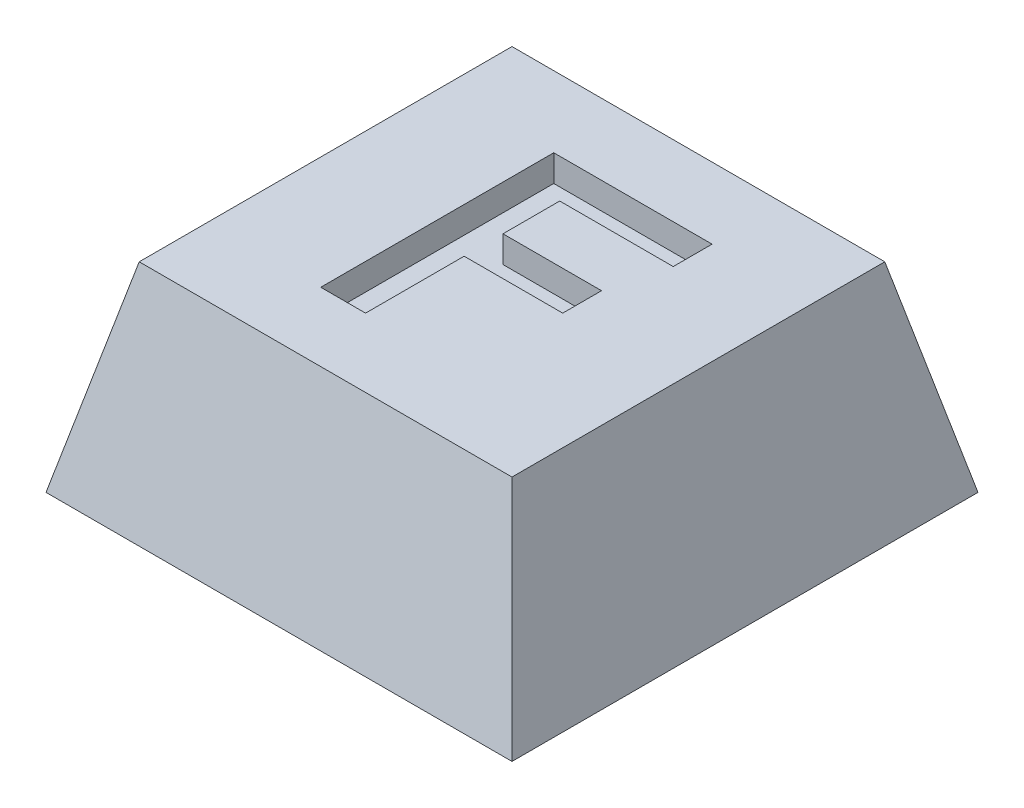
ISO-10303-21;
HEADER;
FILE_DESCRIPTION(('STEP AP214'),'2;1');
FILE_NAME('part.step','',(''),(''),'','','');
FILE_SCHEMA(('AUTOMOTIVE_DESIGN { 1 0 10303 214 1 1 1 1 }'));
ENDSEC;
DATA;
#1=APPLICATION_CONTEXT('core data for automotive mechanical design processes');
#2=APPLICATION_PROTOCOL_DEFINITION('international standard','automotive_design',2000,#1);
#3=PRODUCT_CONTEXT('',#1,'mechanical');
#4=PRODUCT('Part','Part','',(#3));
#5=PRODUCT_RELATED_PRODUCT_CATEGORY('part','',(#4));
#6=PRODUCT_DEFINITION_FORMATION('','',#4);
#7=PRODUCT_DEFINITION_CONTEXT('part definition',#1,'design');
#8=PRODUCT_DEFINITION('design','',#6,#7);
#9=PRODUCT_DEFINITION_SHAPE('','',#8);
#10=(LENGTH_UNIT() NAMED_UNIT(*) SI_UNIT(.MILLI.,.METRE.));
#11=(NAMED_UNIT(*) PLANE_ANGLE_UNIT() SI_UNIT($,.RADIAN.));
#12=(NAMED_UNIT(*) SI_UNIT($,.STERADIAN.) SOLID_ANGLE_UNIT());
#13=UNCERTAINTY_MEASURE_WITH_UNIT(LENGTH_MEASURE(1.E-05),#10,'distance_accuracy_value','');
#14=(GEOMETRIC_REPRESENTATION_CONTEXT(3) GLOBAL_UNCERTAINTY_ASSIGNED_CONTEXT((#13)) GLOBAL_UNIT_ASSIGNED_CONTEXT((#10,
#11,#12)) REPRESENTATION_CONTEXT('',''));
#15=CARTESIAN_POINT('',(0.,0.,0.));
#16=DIRECTION('',(0.,0.,1.));
#17=DIRECTION('',(1.,0.,0.));
#18=AXIS2_PLACEMENT_3D('',#15,#16,#17);
#19=CARTESIAN_POINT('',(0.,3.,0.));
#20=DIRECTION('',(0.,-1.,0.));
#21=DIRECTION('',(0.,0.,-1.));
#22=AXIS2_PLACEMENT_3D('',#19,#20,#21);
#23=PLANE('',#22);
#24=DIRECTION('',(-1.,0.,0.));
#25=VECTOR('',#24,1.);
#26=CARTESIAN_POINT('',(11.,3.,-0.7));
#27=LINE('',#26,#25);
#28=CARTESIAN_POINT('',(6.3,3.,-0.7));
#29=VERTEX_POINT('',#28);
#30=CARTESIAN_POINT('',(0.7,3.,-0.7));
#31=VERTEX_POINT('',#30);
#32=EDGE_CURVE('E65',#29,#31,#27,.T.);
#33=ORIENTED_EDGE('',*,*,#32,.F.);
#34=DIRECTION('',(0.,0.,1.));
#35=VECTOR('',#34,1.);
#36=CARTESIAN_POINT('',(6.3,3.,-7.));
#37=LINE('',#36,#35);
#38=CARTESIAN_POINT('',(6.3,3.,-6.3));
#39=VERTEX_POINT('',#38);
#40=EDGE_CURVE('E194',#39,#29,#37,.T.);
#41=ORIENTED_EDGE('',*,*,#40,.F.);
#42=DIRECTION('',(-1.,0.,0.));
#43=VECTOR('',#42,1.);
#44=CARTESIAN_POINT('',(11.,3.,-6.3));
#45=LINE('',#44,#43);
#46=CARTESIAN_POINT('',(0.699999999999998,3.,-6.3));
#47=VERTEX_POINT('',#46);
#48=EDGE_CURVE('E181',#39,#47,#45,.T.);
#49=ORIENTED_EDGE('',*,*,#48,.T.);
#50=DIRECTION('',(0.,0.,1.));
#51=VECTOR('',#50,1.);
#52=CARTESIAN_POINT('',(0.7,3.,-7.));
#53=LINE('',#52,#51);
#54=EDGE_CURVE('E195',#47,#31,#53,.T.);
#55=ORIENTED_EDGE('',*,*,#54,.T.);
#56=EDGE_LOOP('',(#33,#41,#49,#55));
#57=FACE_BOUND('',#56,.T.);
#58=DIRECTION('',(-1.,0.,0.));
#59=VECTOR('',#58,1.);
#60=CARTESIAN_POINT('',(3.0679593064247,3.,-1.73229448104073));
#61=LINE('',#60,#59);
#62=CARTESIAN_POINT('',(3.0679593064247,3.,-1.73229448104073));
#63=VERTEX_POINT('',#62);
#64=CARTESIAN_POINT('',(2.39488238334778,3.,-1.73229448104073));
#65=VERTEX_POINT('',#64);
#66=EDGE_CURVE('E58',#63,#65,#61,.T.);
#67=ORIENTED_EDGE('',*,*,#66,.T.);
#68=DIRECTION('',(0.,0.,-1.));
#69=VECTOR('',#68,1.);
#70=CARTESIAN_POINT('',(2.39488238334778,3.,-1.73229448104073));
#71=LINE('',#70,#69);
#72=CARTESIAN_POINT('',(2.39488238334778,3.,-5.23229448104073));
#73=VERTEX_POINT('',#72);
#74=EDGE_CURVE('E165',#65,#73,#71,.T.);
#75=ORIENTED_EDGE('',*,*,#74,.T.);
#76=DIRECTION('',(1.,0.,0.));
#77=VECTOR('',#76,1.);
#78=CARTESIAN_POINT('',(2.39488238334778,3.,-5.23229448104073));
#79=LINE('',#78,#77);
#80=CARTESIAN_POINT('',(4.77308751155291,3.,-5.23229448104073));
#81=VERTEX_POINT('',#80);
#82=EDGE_CURVE('E490',#73,#81,#79,.T.);
#83=ORIENTED_EDGE('',*,*,#82,.T.);
#84=DIRECTION('',(0.,0.,1.));
#85=VECTOR('',#84,1.);
#86=CARTESIAN_POINT('',(4.77308751155291,3.,-5.23229448104073));
#87=LINE('',#86,#85);
#88=CARTESIAN_POINT('',(4.77308751155291,3.,-4.6489611477074));
#89=VERTEX_POINT('',#88);
#90=EDGE_CURVE('E492',#81,#89,#87,.T.);
#91=ORIENTED_EDGE('',*,*,#90,.T.);
#92=DIRECTION('',(-1.,0.,0.));
#93=VECTOR('',#92,1.);
#94=CARTESIAN_POINT('',(4.77308751155291,3.,-4.6489611477074));
#95=LINE('',#94,#93);
#96=CARTESIAN_POINT('',(3.0679593064247,3.,-4.6489611477074));
#97=VERTEX_POINT('',#96);
#98=EDGE_CURVE('E497',#89,#97,#95,.T.);
#99=ORIENTED_EDGE('',*,*,#98,.T.);
#100=DIRECTION('',(0.,0.,1.));
#101=VECTOR('',#100,1.);
#102=CARTESIAN_POINT('',(3.0679593064247,3.,-4.6489611477074));
#103=LINE('',#102,#101);
#104=CARTESIAN_POINT('',(3.0679593064247,3.,-3.79639704514329));
#105=VERTEX_POINT('',#104);
#106=EDGE_CURVE('E507',#97,#105,#103,.T.);
#107=ORIENTED_EDGE('',*,*,#106,.T.);
#108=DIRECTION('',(1.,0.,0.));
#109=VECTOR('',#108,1.);
#110=CARTESIAN_POINT('',(3.0679593064247,3.,-3.79639704514329));
#111=LINE('',#110,#109);
#112=CARTESIAN_POINT('',(4.54872853719393,3.,-3.79639704514329));
#113=VERTEX_POINT('',#112);
#114=EDGE_CURVE('E462',#105,#113,#111,.T.);
#115=ORIENTED_EDGE('',*,*,#114,.T.);
#116=DIRECTION('',(0.,0.,1.));
#117=VECTOR('',#116,1.);
#118=CARTESIAN_POINT('',(4.54872853719393,3.,-3.79639704514329));
#119=LINE('',#118,#117);
#120=CARTESIAN_POINT('',(4.54872853719393,3.,-3.21306371180996));
#121=VERTEX_POINT('',#120);
#122=EDGE_CURVE('E457',#113,#121,#119,.T.);
#123=ORIENTED_EDGE('',*,*,#122,.T.);
#124=DIRECTION('',(-1.,0.,0.));
#125=VECTOR('',#124,1.);
#126=CARTESIAN_POINT('',(4.54872853719393,3.,-3.21306371180996));
#127=LINE('',#126,#125);
#128=CARTESIAN_POINT('',(3.0679593064247,3.,-3.21306371180996));
#129=VERTEX_POINT('',#128);
#130=EDGE_CURVE('E451',#121,#129,#127,.T.);
#131=ORIENTED_EDGE('',*,*,#130,.T.);
#132=DIRECTION('',(0.,0.,1.));
#133=VECTOR('',#132,1.);
#134=CARTESIAN_POINT('',(3.0679593064247,3.,-3.21306371180996));
#135=LINE('',#134,#133);
#136=EDGE_CURVE('E161',#129,#63,#135,.T.);
#137=ORIENTED_EDGE('',*,*,#136,.T.);
#138=EDGE_LOOP('',(#67,#75,#83,#91,#99,#107,#115,#123,#131,#137));
#139=FACE_BOUND('',#138,.T.);
#140=ADVANCED_FACE('F42',(#57,#139),#23,.F.);
#141=CARTESIAN_POINT('',(7.,0.,-7.));
#142=DIRECTION('',(-0.973841209741793,-0.227229615606418,0.));
#143=DIRECTION('',(0.227229615606418,-0.973841209741793,0.));
#144=AXIS2_PLACEMENT_3D('',#141,#142,#143);
#145=PLANE('',#144);
#146=DIRECTION('',(-0.221581128241521,0.949633406749377,-0.221581128241521));
#147=VECTOR('',#146,1.);
#148=CARTESIAN_POINT('',(6.6563126252505,1.47294589178357,-0.343687374749499));
#149=LINE('',#148,#147);
#150=CARTESIAN_POINT('',(7.,0.,0.));
#151=VERTEX_POINT('',#150);
#152=EDGE_CURVE('E191',#151,#29,#149,.T.);
#153=ORIENTED_EDGE('',*,*,#152,.F.);
#154=DIRECTION('',(0.,0.,-1.));
#155=VECTOR('',#154,1.);
#156=CARTESIAN_POINT('',(7.,0.,0.));
#157=LINE('',#156,#155);
#158=CARTESIAN_POINT('',(7.,0.,-7.));
#159=VERTEX_POINT('',#158);
#160=EDGE_CURVE('E209',#151,#159,#157,.T.);
#161=ORIENTED_EDGE('',*,*,#160,.T.);
#162=DIRECTION('',(0.221581128241521,-0.949633406749377,-0.221581128241521));
#163=VECTOR('',#162,1.);
#164=CARTESIAN_POINT('',(7.,0.,-7.));
#165=LINE('',#164,#163);
#166=EDGE_CURVE('E185',#39,#159,#165,.T.);
#167=ORIENTED_EDGE('',*,*,#166,.F.);
#168=ORIENTED_EDGE('',*,*,#40,.T.);
#169=EDGE_LOOP('',(#153,#161,#167,#168));
#170=FACE_BOUND('',#169,.T.);
#171=ADVANCED_FACE('F234',(#170),#145,.F.);
#172=CARTESIAN_POINT('',(0.,0.,-7.));
#173=DIRECTION('',(0.973841209741793,-0.227229615606418,0.));
#174=DIRECTION('',(0.227229615606418,0.973841209741793,0.));
#175=AXIS2_PLACEMENT_3D('',#172,#173,#174);
#176=PLANE('',#175);
#177=DIRECTION('',(-0.221581128241521,-0.949633406749378,0.221581128241521));
#178=VECTOR('',#177,1.);
#179=CARTESIAN_POINT('',(0.343687374749499,1.47294589178357,-0.3436873747495));
#180=LINE('',#179,#178);
#181=CARTESIAN_POINT('',(0.,0.,0.));
#182=VERTEX_POINT('',#181);
#183=EDGE_CURVE('E11',#31,#182,#180,.T.);
#184=ORIENTED_EDGE('',*,*,#183,.F.);
#185=ORIENTED_EDGE('',*,*,#54,.F.);
#186=DIRECTION('',(0.221581128241521,0.949633406749377,0.221581128241521));
#187=VECTOR('',#186,1.);
#188=CARTESIAN_POINT('',(0.,0.,-7.));
#189=LINE('',#188,#187);
#190=CARTESIAN_POINT('',(0.,0.,-7.));
#191=VERTEX_POINT('',#190);
#192=EDGE_CURVE('E51',#191,#47,#189,.T.);
#193=ORIENTED_EDGE('',*,*,#192,.F.);
#194=DIRECTION('',(0.,0.,1.));
#195=VECTOR('',#194,1.);
#196=CARTESIAN_POINT('',(0.,0.,0.));
#197=LINE('',#196,#195);
#198=EDGE_CURVE('E199',#191,#182,#197,.T.);
#199=ORIENTED_EDGE('',*,*,#198,.T.);
#200=EDGE_LOOP('',(#184,#185,#193,#199));
#201=FACE_BOUND('',#200,.T.);
#202=ADVANCED_FACE('F227',(#201),#176,.F.);
#203=CARTESIAN_POINT('',(0.,0.,0.));
#204=DIRECTION('',(0.,-1.,0.));
#205=DIRECTION('',(0.,0.,-1.));
#206=AXIS2_PLACEMENT_3D('',#203,#204,#205);
#207=PLANE('',#206);
#208=CARTESIAN_POINT('',(3.5,0.,-3.5));
#209=DIRECTION('',(0.,-1.,0.));
#210=DIRECTION('',(0.,0.,-1.));
#211=AXIS2_PLACEMENT_3D('',#208,#209,#210);
#212=CIRCLE('',#211,1.8);
#213=CARTESIAN_POINT('',(3.5,0.,-5.3));
#214=VERTEX_POINT('',#213);
#215=EDGE_CURVE('E167',#214,#214,#212,.T.);
#216=ORIENTED_EDGE('',*,*,#215,.F.);
#217=EDGE_LOOP('',(#216));
#218=FACE_BOUND('',#217,.T.);
#219=ORIENTED_EDGE('',*,*,#198,.F.);
#220=DIRECTION('',(-1.,0.,0.));
#221=VECTOR('',#220,1.);
#222=CARTESIAN_POINT('',(0.,0.,-7.));
#223=LINE('',#222,#221);
#224=EDGE_CURVE('E213',#159,#191,#223,.T.);
#225=ORIENTED_EDGE('',*,*,#224,.F.);
#226=ORIENTED_EDGE('',*,*,#160,.F.);
#227=DIRECTION('',(1.,0.,0.));
#228=VECTOR('',#227,1.);
#229=CARTESIAN_POINT('',(0.,0.,0.));
#230=LINE('',#229,#228);
#231=EDGE_CURVE('E206',#182,#151,#230,.T.);
#232=ORIENTED_EDGE('',*,*,#231,.F.);
#233=EDGE_LOOP('',(#219,#225,#226,#232));
#234=FACE_BOUND('',#233,.T.);
#235=ADVANCED_FACE('F44',(#218,#234),#207,.T.);
#236=CARTESIAN_POINT('',(11.,3.,-6.3));
#237=DIRECTION('',(0.,0.227229615606418,-0.973841209741793));
#238=DIRECTION('',(0.,0.973841209741793,0.227229615606418));
#239=AXIS2_PLACEMENT_3D('',#236,#237,#238);
#240=PLANE('',#239);
#241=ORIENTED_EDGE('',*,*,#166,.T.);
#242=ORIENTED_EDGE('',*,*,#224,.T.);
#243=ORIENTED_EDGE('',*,*,#192,.T.);
#244=ORIENTED_EDGE('',*,*,#48,.F.);
#245=EDGE_LOOP('',(#241,#242,#243,#244));
#246=FACE_BOUND('',#245,.T.);
#247=ADVANCED_FACE('F218',(#246),#240,.T.);
#248=CARTESIAN_POINT('',(11.,0.,0.));
#249=DIRECTION('',(0.,0.227229615606418,0.973841209741793));
#250=DIRECTION('',(0.,-0.973841209741793,0.227229615606418));
#251=AXIS2_PLACEMENT_3D('',#248,#249,#250);
#252=PLANE('',#251);
#253=ORIENTED_EDGE('',*,*,#152,.T.);
#254=ORIENTED_EDGE('',*,*,#32,.T.);
#255=ORIENTED_EDGE('',*,*,#183,.T.);
#256=ORIENTED_EDGE('',*,*,#231,.T.);
#257=EDGE_LOOP('',(#253,#254,#255,#256));
#258=FACE_BOUND('',#257,.T.);
#259=ADVANCED_FACE('F229',(#258),#252,.T.);
#260=CARTESIAN_POINT('',(3.5,0.8,-3.5));
#261=DIRECTION('',(0.,-1.,0.));
#262=DIRECTION('',(0.,0.,-1.));
#263=AXIS2_PLACEMENT_3D('',#260,#261,#262);
#264=CYLINDRICAL_SURFACE('',#263,1.8);
#265=CARTESIAN_POINT('',(3.5,0.8,-3.5));
#266=DIRECTION('',(0.,-1.,0.));
#267=DIRECTION('',(0.,0.,-1.));
#268=AXIS2_PLACEMENT_3D('',#265,#266,#267);
#269=CIRCLE('',#268,1.8);
#270=CARTESIAN_POINT('',(3.5,0.8,-5.3));
#271=VERTEX_POINT('',#270);
#272=EDGE_CURVE('E173',#271,#271,#269,.T.);
#273=ORIENTED_EDGE('',*,*,#272,.F.);
#274=EDGE_LOOP('',(#273));
#275=FACE_BOUND('',#274,.T.);
#276=ORIENTED_EDGE('',*,*,#215,.T.);
#277=EDGE_LOOP('',(#276));
#278=FACE_BOUND('',#277,.T.);
#279=ADVANCED_FACE('F254',(#275,#278),#264,.F.);
#280=CARTESIAN_POINT('',(3.5,0.8,-3.5));
#281=DIRECTION('',(0.,-1.,0.));
#282=DIRECTION('',(0.,0.,-1.));
#283=AXIS2_PLACEMENT_3D('',#280,#281,#282);
#284=PLANE('',#283);
#285=ORIENTED_EDGE('',*,*,#272,.T.);
#286=EDGE_LOOP('',(#285));
#287=FACE_BOUND('',#286,.T.);
#288=ADVANCED_FACE('F257',(#287),#284,.T.);
#289=CARTESIAN_POINT('',(3.0679593064247,2.6,-1.73229448104073));
#290=DIRECTION('',(0.,0.,-1.));
#291=DIRECTION('',(-1.,0.,0.));
#292=AXIS2_PLACEMENT_3D('',#289,#290,#291);
#293=PLANE('',#292);
#294=ORIENTED_EDGE('',*,*,#66,.F.);
#295=DIRECTION('',(0.,1.,0.));
#296=VECTOR('',#295,1.);
#297=CARTESIAN_POINT('',(3.0679593064247,2.6,-1.73229448104073));
#298=LINE('',#297,#296);
#299=CARTESIAN_POINT('',(3.0679593064247,2.6,-1.73229448104073));
#300=VERTEX_POINT('',#299);
#301=EDGE_CURVE('E159',#300,#63,#298,.T.);
#302=ORIENTED_EDGE('',*,*,#301,.F.);
#303=DIRECTION('',(-1.,0.,0.));
#304=VECTOR('',#303,1.);
#305=CARTESIAN_POINT('',(3.0679593064247,2.6,-1.73229448104073));
#306=LINE('',#305,#304);
#307=CARTESIAN_POINT('',(2.39488238334778,2.6,-1.73229448104073));
#308=VERTEX_POINT('',#307);
#309=EDGE_CURVE('E149',#300,#308,#306,.T.);
#310=ORIENTED_EDGE('',*,*,#309,.T.);
#311=DIRECTION('',(0.,1.,0.));
#312=VECTOR('',#311,1.);
#313=CARTESIAN_POINT('',(2.39488238334778,2.6,-1.73229448104073));
#314=LINE('',#313,#312);
#315=EDGE_CURVE('E158',#308,#65,#314,.T.);
#316=ORIENTED_EDGE('',*,*,#315,.T.);
#317=EDGE_LOOP('',(#294,#302,#310,#316));
#318=FACE_BOUND('',#317,.T.);
#319=ADVANCED_FACE('F157',(#318),#293,.T.);
#320=CARTESIAN_POINT('',(2.39488238334778,2.6,-1.73229448104073));
#321=DIRECTION('',(1.,0.,0.));
#322=DIRECTION('',(0.,0.,-1.));
#323=AXIS2_PLACEMENT_3D('',#320,#321,#322);
#324=PLANE('',#323);
#325=ORIENTED_EDGE('',*,*,#74,.F.);
#326=ORIENTED_EDGE('',*,*,#315,.F.);
#327=DIRECTION('',(0.,0.,-1.));
#328=VECTOR('',#327,1.);
#329=CARTESIAN_POINT('',(2.39488238334778,2.6,-1.73229448104073));
#330=LINE('',#329,#328);
#331=CARTESIAN_POINT('',(2.39488238334778,2.6,-5.23229448104073));
#332=VERTEX_POINT('',#331);
#333=EDGE_CURVE('E145',#308,#332,#330,.T.);
#334=ORIENTED_EDGE('',*,*,#333,.T.);
#335=DIRECTION('',(0.,1.,0.));
#336=VECTOR('',#335,1.);
#337=CARTESIAN_POINT('',(2.39488238334778,2.6,-5.23229448104073));
#338=LINE('',#337,#336);
#339=EDGE_CURVE('E168',#332,#73,#338,.T.);
#340=ORIENTED_EDGE('',*,*,#339,.T.);
#341=EDGE_LOOP('',(#325,#326,#334,#340));
#342=FACE_BOUND('',#341,.T.);
#343=ADVANCED_FACE('F163',(#342),#324,.T.);
#344=CARTESIAN_POINT('',(2.39488238334778,2.6,-5.23229448104073));
#345=DIRECTION('',(0.,0.,1.));
#346=DIRECTION('',(1.,0.,0.));
#347=AXIS2_PLACEMENT_3D('',#344,#345,#346);
#348=PLANE('',#347);
#349=ORIENTED_EDGE('',*,*,#82,.F.);
#350=ORIENTED_EDGE('',*,*,#339,.F.);
#351=DIRECTION('',(1.,0.,0.));
#352=VECTOR('',#351,1.);
#353=CARTESIAN_POINT('',(2.39488238334778,2.6,-5.23229448104073));
#354=LINE('',#353,#352);
#355=CARTESIAN_POINT('',(4.77308751155291,2.6,-5.23229448104073));
#356=VERTEX_POINT('',#355);
#357=EDGE_CURVE('E151',#332,#356,#354,.T.);
#358=ORIENTED_EDGE('',*,*,#357,.T.);
#359=DIRECTION('',(0.,1.,0.));
#360=VECTOR('',#359,1.);
#361=CARTESIAN_POINT('',(4.77308751155291,2.6,-5.23229448104073));
#362=LINE('',#361,#360);
#363=EDGE_CURVE('E175',#356,#81,#362,.T.);
#364=ORIENTED_EDGE('',*,*,#363,.T.);
#365=EDGE_LOOP('',(#349,#350,#358,#364));
#366=FACE_BOUND('',#365,.T.);
#367=ADVANCED_FACE('F266',(#366),#348,.T.);
#368=CARTESIAN_POINT('',(4.77308751155291,2.6,-5.23229448104073));
#369=DIRECTION('',(-1.,0.,0.));
#370=DIRECTION('',(0.,0.,1.));
#371=AXIS2_PLACEMENT_3D('',#368,#369,#370);
#372=PLANE('',#371);
#373=ORIENTED_EDGE('',*,*,#90,.F.);
#374=ORIENTED_EDGE('',*,*,#363,.F.);
#375=DIRECTION('',(0.,0.,1.));
#376=VECTOR('',#375,1.);
#377=CARTESIAN_POINT('',(4.77308751155291,2.6,-5.23229448104073));
#378=LINE('',#377,#376);
#379=CARTESIAN_POINT('',(4.77308751155291,2.6,-4.6489611477074));
#380=VERTEX_POINT('',#379);
#381=EDGE_CURVE('E537',#356,#380,#378,.T.);
#382=ORIENTED_EDGE('',*,*,#381,.T.);
#383=DIRECTION('',(0.,1.,0.));
#384=VECTOR('',#383,1.);
#385=CARTESIAN_POINT('',(4.77308751155291,2.6,-4.6489611477074));
#386=LINE('',#385,#384);
#387=EDGE_CURVE('E483',#380,#89,#386,.T.);
#388=ORIENTED_EDGE('',*,*,#387,.T.);
#389=EDGE_LOOP('',(#373,#374,#382,#388));
#390=FACE_BOUND('',#389,.T.);
#391=ADVANCED_FACE('F269',(#390),#372,.T.);
#392=CARTESIAN_POINT('',(4.77308751155291,2.6,-4.6489611477074));
#393=DIRECTION('',(0.,0.,-1.));
#394=DIRECTION('',(-1.,0.,0.));
#395=AXIS2_PLACEMENT_3D('',#392,#393,#394);
#396=PLANE('',#395);
#397=ORIENTED_EDGE('',*,*,#98,.F.);
#398=ORIENTED_EDGE('',*,*,#387,.F.);
#399=DIRECTION('',(-1.,0.,0.));
#400=VECTOR('',#399,1.);
#401=CARTESIAN_POINT('',(4.77308751155291,2.6,-4.6489611477074));
#402=LINE('',#401,#400);
#403=CARTESIAN_POINT('',(3.0679593064247,2.6,-4.6489611477074));
#404=VERTEX_POINT('',#403);
#405=EDGE_CURVE('E534',#380,#404,#402,.T.);
#406=ORIENTED_EDGE('',*,*,#405,.T.);
#407=DIRECTION('',(0.,1.,0.));
#408=VECTOR('',#407,1.);
#409=CARTESIAN_POINT('',(3.0679593064247,2.6,-4.6489611477074));
#410=LINE('',#409,#408);
#411=EDGE_CURVE('E480',#404,#97,#410,.T.);
#412=ORIENTED_EDGE('',*,*,#411,.T.);
#413=EDGE_LOOP('',(#397,#398,#406,#412));
#414=FACE_BOUND('',#413,.T.);
#415=ADVANCED_FACE('F273',(#414),#396,.T.);
#416=CARTESIAN_POINT('',(3.0679593064247,2.6,-4.6489611477074));
#417=DIRECTION('',(-1.,0.,0.));
#418=DIRECTION('',(0.,0.,1.));
#419=AXIS2_PLACEMENT_3D('',#416,#417,#418);
#420=PLANE('',#419);
#421=ORIENTED_EDGE('',*,*,#106,.F.);
#422=ORIENTED_EDGE('',*,*,#411,.F.);
#423=DIRECTION('',(0.,0.,1.));
#424=VECTOR('',#423,1.);
#425=CARTESIAN_POINT('',(3.0679593064247,2.6,-4.6489611477074));
#426=LINE('',#425,#424);
#427=CARTESIAN_POINT('',(3.0679593064247,2.6,-3.79639704514329));
#428=VERTEX_POINT('',#427);
#429=EDGE_CURVE('E531',#404,#428,#426,.T.);
#430=ORIENTED_EDGE('',*,*,#429,.T.);
#431=DIRECTION('',(0.,1.,0.));
#432=VECTOR('',#431,1.);
#433=CARTESIAN_POINT('',(3.0679593064247,2.6,-3.79639704514329));
#434=LINE('',#433,#432);
#435=EDGE_CURVE('E477',#428,#105,#434,.T.);
#436=ORIENTED_EDGE('',*,*,#435,.T.);
#437=EDGE_LOOP('',(#421,#422,#430,#436));
#438=FACE_BOUND('',#437,.T.);
#439=ADVANCED_FACE('F277',(#438),#420,.T.);
#440=CARTESIAN_POINT('',(3.0679593064247,2.6,-3.79639704514329));
#441=DIRECTION('',(0.,0.,1.));
#442=DIRECTION('',(1.,0.,0.));
#443=AXIS2_PLACEMENT_3D('',#440,#441,#442);
#444=PLANE('',#443);
#445=ORIENTED_EDGE('',*,*,#114,.F.);
#446=ORIENTED_EDGE('',*,*,#435,.F.);
#447=DIRECTION('',(1.,0.,0.));
#448=VECTOR('',#447,1.);
#449=CARTESIAN_POINT('',(3.0679593064247,2.6,-3.79639704514329));
#450=LINE('',#449,#448);
#451=CARTESIAN_POINT('',(4.54872853719393,2.6,-3.79639704514329));
#452=VERTEX_POINT('',#451);
#453=EDGE_CURVE('E516',#428,#452,#450,.T.);
#454=ORIENTED_EDGE('',*,*,#453,.T.);
#455=DIRECTION('',(0.,1.,0.));
#456=VECTOR('',#455,1.);
#457=CARTESIAN_POINT('',(4.54872853719393,2.6,-3.79639704514329));
#458=LINE('',#457,#456);
#459=EDGE_CURVE('E474',#452,#113,#458,.T.);
#460=ORIENTED_EDGE('',*,*,#459,.T.);
#461=EDGE_LOOP('',(#445,#446,#454,#460));
#462=FACE_BOUND('',#461,.T.);
#463=ADVANCED_FACE('F281',(#462),#444,.T.);
#464=CARTESIAN_POINT('',(4.54872853719393,2.6,-3.79639704514329));
#465=DIRECTION('',(-1.,0.,0.));
#466=DIRECTION('',(0.,0.,1.));
#467=AXIS2_PLACEMENT_3D('',#464,#465,#466);
#468=PLANE('',#467);
#469=ORIENTED_EDGE('',*,*,#122,.F.);
#470=ORIENTED_EDGE('',*,*,#459,.F.);
#471=DIRECTION('',(0.,0.,1.));
#472=VECTOR('',#471,1.);
#473=CARTESIAN_POINT('',(4.54872853719393,2.6,-3.79639704514329));
#474=LINE('',#473,#472);
#475=CARTESIAN_POINT('',(4.54872853719393,2.6,-3.21306371180996));
#476=VERTEX_POINT('',#475);
#477=EDGE_CURVE('E518',#452,#476,#474,.T.);
#478=ORIENTED_EDGE('',*,*,#477,.T.);
#479=DIRECTION('',(0.,1.,0.));
#480=VECTOR('',#479,1.);
#481=CARTESIAN_POINT('',(4.54872853719393,2.6,-3.21306371180996));
#482=LINE('',#481,#480);
#483=EDGE_CURVE('E471',#476,#121,#482,.T.);
#484=ORIENTED_EDGE('',*,*,#483,.T.);
#485=EDGE_LOOP('',(#469,#470,#478,#484));
#486=FACE_BOUND('',#485,.T.);
#487=ADVANCED_FACE('F285',(#486),#468,.T.);
#488=CARTESIAN_POINT('',(4.54872853719393,2.6,-3.21306371180996));
#489=DIRECTION('',(0.,0.,-1.));
#490=DIRECTION('',(-1.,0.,0.));
#491=AXIS2_PLACEMENT_3D('',#488,#489,#490);
#492=PLANE('',#491);
#493=ORIENTED_EDGE('',*,*,#130,.F.);
#494=ORIENTED_EDGE('',*,*,#483,.F.);
#495=DIRECTION('',(-1.,0.,0.));
#496=VECTOR('',#495,1.);
#497=CARTESIAN_POINT('',(4.54872853719393,2.6,-3.21306371180996));
#498=LINE('',#497,#496);
#499=CARTESIAN_POINT('',(3.0679593064247,2.6,-3.21306371180996));
#500=VERTEX_POINT('',#499);
#501=EDGE_CURVE('E520',#476,#500,#498,.T.);
#502=ORIENTED_EDGE('',*,*,#501,.T.);
#503=DIRECTION('',(0.,1.,0.));
#504=VECTOR('',#503,1.);
#505=CARTESIAN_POINT('',(3.0679593064247,2.6,-3.21306371180996));
#506=LINE('',#505,#504);
#507=EDGE_CURVE('E449',#500,#129,#506,.T.);
#508=ORIENTED_EDGE('',*,*,#507,.T.);
#509=EDGE_LOOP('',(#493,#494,#502,#508));
#510=FACE_BOUND('',#509,.T.);
#511=ADVANCED_FACE('F289',(#510),#492,.T.);
#512=CARTESIAN_POINT('',(3.0679593064247,2.6,-3.21306371180996));
#513=DIRECTION('',(-1.,0.,0.));
#514=DIRECTION('',(0.,0.,1.));
#515=AXIS2_PLACEMENT_3D('',#512,#513,#514);
#516=PLANE('',#515);
#517=ORIENTED_EDGE('',*,*,#136,.F.);
#518=ORIENTED_EDGE('',*,*,#507,.F.);
#519=DIRECTION('',(0.,0.,1.));
#520=VECTOR('',#519,1.);
#521=CARTESIAN_POINT('',(3.0679593064247,2.6,-3.21306371180996));
#522=LINE('',#521,#520);
#523=EDGE_CURVE('E468',#500,#300,#522,.T.);
#524=ORIENTED_EDGE('',*,*,#523,.T.);
#525=ORIENTED_EDGE('',*,*,#301,.T.);
#526=EDGE_LOOP('',(#517,#518,#524,#525));
#527=FACE_BOUND('',#526,.T.);
#528=ADVANCED_FACE('F293',(#527),#516,.T.);
#529=CARTESIAN_POINT('',(0.,2.6,0.));
#530=DIRECTION('',(0.,-1.,0.));
#531=DIRECTION('',(0.,0.,-1.));
#532=AXIS2_PLACEMENT_3D('',#529,#530,#531);
#533=PLANE('',#532);
#534=ORIENTED_EDGE('',*,*,#309,.F.);
#535=ORIENTED_EDGE('',*,*,#523,.F.);
#536=ORIENTED_EDGE('',*,*,#501,.F.);
#537=ORIENTED_EDGE('',*,*,#477,.F.);
#538=ORIENTED_EDGE('',*,*,#453,.F.);
#539=ORIENTED_EDGE('',*,*,#429,.F.);
#540=ORIENTED_EDGE('',*,*,#405,.F.);
#541=ORIENTED_EDGE('',*,*,#381,.F.);
#542=ORIENTED_EDGE('',*,*,#357,.F.);
#543=ORIENTED_EDGE('',*,*,#333,.F.);
#544=EDGE_LOOP('',(#534,#535,#536,#537,#538,#539,#540,#541,#542,#543));
#545=FACE_BOUND('',#544,.T.);
#546=ADVANCED_FACE('F147',(#545),#533,.F.);
#547=CLOSED_SHELL('',(#140,#171,#202,#235,#247,#259,#279,#288,#319,#343,#367,#391,#415,#439,
#463,#487,#511,#528,#546));
#548=MANIFOLD_SOLID_BREP('B2',#547);
#549=ADVANCED_BREP_SHAPE_REPRESENTATION('',(#18,#548),#14);
#550=SHAPE_DEFINITION_REPRESENTATION(#9,#549);
ENDSEC;
END-ISO-10303-21;
